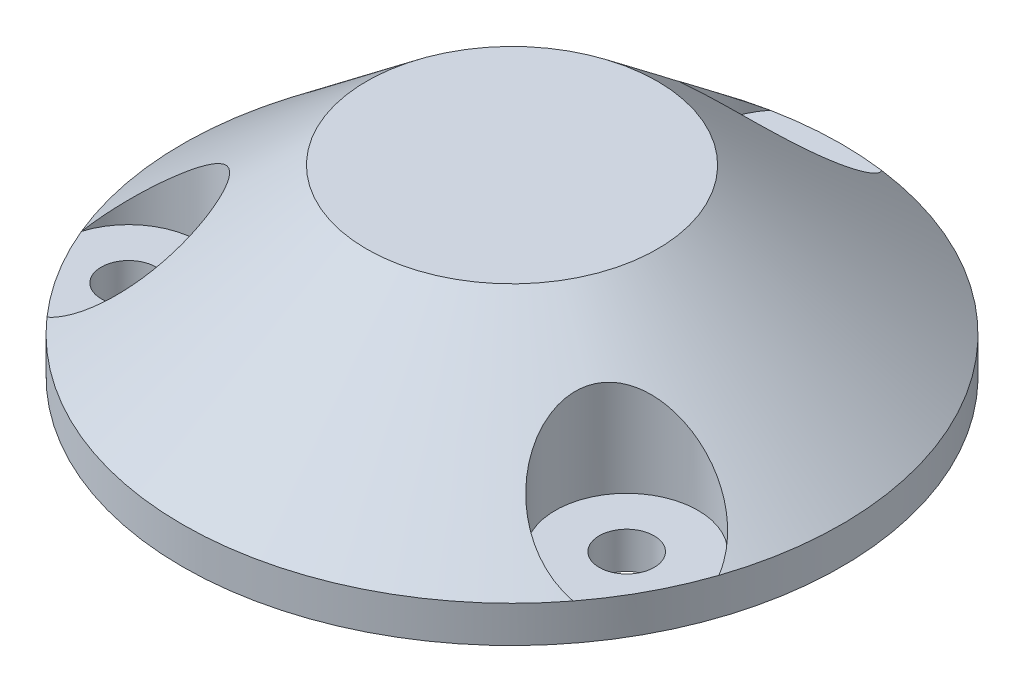
ISO-10303-21;
HEADER;
FILE_DESCRIPTION(('STEP AP214'),'2;1');
FILE_NAME('part.step','',(''),(''),'','','');
FILE_SCHEMA(('AUTOMOTIVE_DESIGN { 1 0 10303 214 1 1 1 1 }'));
ENDSEC;
DATA;
#1=APPLICATION_CONTEXT('core data for automotive mechanical design processes');
#2=APPLICATION_PROTOCOL_DEFINITION('international standard','automotive_design',2000,#1);
#3=PRODUCT_CONTEXT('',#1,'mechanical');
#4=PRODUCT('Part','Part','',(#3));
#5=PRODUCT_RELATED_PRODUCT_CATEGORY('part','',(#4));
#6=PRODUCT_DEFINITION_FORMATION('','',#4);
#7=PRODUCT_DEFINITION_CONTEXT('part definition',#1,'design');
#8=PRODUCT_DEFINITION('design','',#6,#7);
#9=PRODUCT_DEFINITION_SHAPE('','',#8);
#10=(LENGTH_UNIT() NAMED_UNIT(*) SI_UNIT(.MILLI.,.METRE.));
#11=(NAMED_UNIT(*) PLANE_ANGLE_UNIT() SI_UNIT($,.RADIAN.));
#12=(NAMED_UNIT(*) SI_UNIT($,.STERADIAN.) SOLID_ANGLE_UNIT());
#13=UNCERTAINTY_MEASURE_WITH_UNIT(LENGTH_MEASURE(1.E-05),#10,'distance_accuracy_value','');
#14=(GEOMETRIC_REPRESENTATION_CONTEXT(3) GLOBAL_UNCERTAINTY_ASSIGNED_CONTEXT((#13)) GLOBAL_UNIT_ASSIGNED_CONTEXT((#10,
#11,#12)) REPRESENTATION_CONTEXT('',''));
#15=CARTESIAN_POINT('',(0.,0.,0.));
#16=DIRECTION('',(0.,0.,1.));
#17=DIRECTION('',(1.,0.,0.));
#18=AXIS2_PLACEMENT_3D('',#15,#16,#17);
#19=CARTESIAN_POINT('',(-0.514611842093936,11.,-15.1912861421265));
#20=DIRECTION('',(0.,-1.,0.));
#21=DIRECTION('',(0.,0.,-1.));
#22=AXIS2_PLACEMENT_3D('',#19,#20,#21);
#23=CYLINDRICAL_SURFACE('',#22,1.50000000000036);
#24=CARTESIAN_POINT('',(-0.514611842093936,7.,-15.1912861421265));
#25=DIRECTION('',(0.,-1.,0.));
#26=DIRECTION('',(0.,0.,-1.));
#27=AXIS2_PLACEMENT_3D('',#24,#25,#26);
#28=CIRCLE('',#27,1.50000000000036);
#29=CARTESIAN_POINT('',(-0.514611842093936,7.,-16.6912861421269));
#30=VERTEX_POINT('',#29);
#31=EDGE_CURVE('E112',#30,#30,#28,.T.);
#32=ORIENTED_EDGE('',*,*,#31,.T.);
#33=EDGE_LOOP('',(#32));
#34=FACE_BOUND('',#33,.T.);
#35=CARTESIAN_POINT('',(-0.514611842093936,9.,-15.1912861421265));
#36=DIRECTION('',(0.,1.,0.));
#37=DIRECTION('',(0.,0.,1.));
#38=AXIS2_PLACEMENT_3D('',#35,#36,#37);
#39=CIRCLE('',#38,1.50000000000036);
#40=CARTESIAN_POINT('',(-0.514611842093936,9.,-13.6912861421262));
#41=VERTEX_POINT('',#40);
#42=EDGE_CURVE('E113',#41,#41,#39,.F.);
#43=ORIENTED_EDGE('',*,*,#42,.F.);
#44=EDGE_LOOP('',(#43));
#45=FACE_BOUND('',#44,.T.);
#46=ADVANCED_FACE('F33',(#34,#45),#23,.F.);
#47=CARTESIAN_POINT('',(13.4133456362877,11.,7.14997614272195));
#48=DIRECTION('',(0.,-1.,0.));
#49=DIRECTION('',(0.,0.,-1.));
#50=AXIS2_PLACEMENT_3D('',#47,#48,#49);
#51=CYLINDRICAL_SURFACE('',#50,1.50000000000077);
#52=CARTESIAN_POINT('',(13.4133456362877,7.,7.14997614272195));
#53=DIRECTION('',(0.,-1.,0.));
#54=DIRECTION('',(0.,0.,-1.));
#55=AXIS2_PLACEMENT_3D('',#52,#53,#54);
#56=CIRCLE('',#55,1.50000000000077);
#57=CARTESIAN_POINT('',(13.4133456362877,7.,5.64997614272117));
#58=VERTEX_POINT('',#57);
#59=EDGE_CURVE('E116',#58,#58,#56,.T.);
#60=ORIENTED_EDGE('',*,*,#59,.T.);
#61=EDGE_LOOP('',(#60));
#62=FACE_BOUND('',#61,.T.);
#63=CARTESIAN_POINT('',(13.4133456362877,9.,7.14997614272195));
#64=DIRECTION('',(0.,1.,0.));
#65=DIRECTION('',(0.,0.,1.));
#66=AXIS2_PLACEMENT_3D('',#63,#64,#65);
#67=CIRCLE('',#66,1.50000000000077);
#68=CARTESIAN_POINT('',(13.4133456362877,9.,8.64997614272272));
#69=VERTEX_POINT('',#68);
#70=EDGE_CURVE('E78',#69,#69,#67,.F.);
#71=ORIENTED_EDGE('',*,*,#70,.F.);
#72=EDGE_LOOP('',(#71));
#73=FACE_BOUND('',#72,.T.);
#74=ADVANCED_FACE('F139',(#62,#73),#51,.F.);
#75=CARTESIAN_POINT('',(-12.8987337941931,11.,8.04130999940566));
#76=DIRECTION('',(0.,-1.,0.));
#77=DIRECTION('',(0.,0.,-1.));
#78=AXIS2_PLACEMENT_3D('',#75,#76,#77);
#79=CYLINDRICAL_SURFACE('',#78,1.5);
#80=CARTESIAN_POINT('',(-12.8987337941931,7.,8.04130999940566));
#81=DIRECTION('',(0.,-1.,0.));
#82=DIRECTION('',(0.,0.,-1.));
#83=AXIS2_PLACEMENT_3D('',#80,#81,#82);
#84=CIRCLE('',#83,1.5);
#85=CARTESIAN_POINT('',(-12.8987337941931,7.,6.54130999940567));
#86=VERTEX_POINT('',#85);
#87=EDGE_CURVE('E121',#86,#86,#84,.T.);
#88=ORIENTED_EDGE('',*,*,#87,.T.);
#89=EDGE_LOOP('',(#88));
#90=FACE_BOUND('',#89,.T.);
#91=CARTESIAN_POINT('',(-12.8987337941931,9.,8.04130999940566));
#92=DIRECTION('',(0.,1.,0.));
#93=DIRECTION('',(0.,0.,1.));
#94=AXIS2_PLACEMENT_3D('',#91,#92,#93);
#95=CIRCLE('',#94,1.5);
#96=CARTESIAN_POINT('',(-12.8987337941931,9.,9.54130999940566));
#97=VERTEX_POINT('',#96);
#98=EDGE_CURVE('E79',#97,#97,#95,.F.);
#99=ORIENTED_EDGE('',*,*,#98,.F.);
#100=EDGE_LOOP('',(#99));
#101=FACE_BOUND('',#100,.T.);
#102=ADVANCED_FACE('F136',(#90,#101),#79,.F.);
#103=CARTESIAN_POINT('',(0.,9.,0.));
#104=DIRECTION('',(0.,-1.,0.));
#105=DIRECTION('',(0.,0.,-1.));
#106=AXIS2_PLACEMENT_3D('',#103,#104,#105);
#107=CYLINDRICAL_SURFACE('',#106,18.);
#108=CARTESIAN_POINT('',(0.,9.,0.));
#109=DIRECTION('',(0.,1.,0.));
#110=DIRECTION('',(0.,0.,1.));
#111=AXIS2_PLACEMENT_3D('',#108,#109,#110);
#112=CIRCLE('',#111,18.);
#113=CARTESIAN_POINT('',(14.285312354494,9.,10.9512488299071));
#114=VERTEX_POINT('',#113);
#115=CARTESIAN_POINT('',(17.0552623288384,9.,5.75482640003215));
#116=VERTEX_POINT('',#115);
#117=EDGE_CURVE('E96',#114,#116,#112,.T.);
#118=ORIENTED_EDGE('',*,*,#117,.F.);
#119=CARTESIAN_POINT('',(-13.5114570212166,9.,11.8928772449654));
#120=VERTEX_POINT('',#119);
#121=EDGE_CURVE('E93',#120,#114,#112,.T.);
#122=ORIENTED_EDGE('',*,*,#121,.F.);
#123=CARTESIAN_POINT('',(0.,9.,0.));
#124=DIRECTION('',(0.,1.,0.));
#125=DIRECTION('',(0.,0.,1.));
#126=AXIS2_PLACEMENT_3D('',#123,#124,#125);
#127=CIRCLE('',#126,18.);
#128=CARTESIAN_POINT('',(-16.626715867111,9.,6.89581898503428));
#129=VERTEX_POINT('',#128);
#130=EDGE_CURVE('E72',#129,#120,#127,.T.);
#131=ORIENTED_EDGE('',*,*,#130,.F.);
#132=CARTESIAN_POINT('',(-3.54380530761995,9.,-17.6477036449983));
#133=VERTEX_POINT('',#132);
#134=EDGE_CURVE('E95',#133,#129,#112,.T.);
#135=ORIENTED_EDGE('',*,*,#134,.F.);
#136=CARTESIAN_POINT('',(0.,9.,0.));
#137=DIRECTION('',(0.,1.,0.));
#138=DIRECTION('',(0.,0.,1.));
#139=AXIS2_PLACEMENT_3D('',#136,#137,#138);
#140=CIRCLE('',#139,18.);
#141=CARTESIAN_POINT('',(2.34140351261658,9.,-17.8470678149411));
#142=VERTEX_POINT('',#141);
#143=EDGE_CURVE('E111',#142,#133,#140,.T.);
#144=ORIENTED_EDGE('',*,*,#143,.F.);
#145=EDGE_CURVE('E102',#116,#142,#112,.T.);
#146=ORIENTED_EDGE('',*,*,#145,.F.);
#147=EDGE_LOOP('',(#118,#122,#131,#135,#144,#146));
#148=FACE_BOUND('',#147,.T.);
#149=CARTESIAN_POINT('',(0.,7.,0.));
#150=DIRECTION('',(0.,1.,0.));
#151=DIRECTION('',(0.,0.,1.));
#152=AXIS2_PLACEMENT_3D('',#149,#150,#151);
#153=CIRCLE('',#152,18.);
#154=CARTESIAN_POINT('',(0.,7.,18.));
#155=VERTEX_POINT('',#154);
#156=EDGE_CURVE('E100',#155,#155,#153,.T.);
#157=ORIENTED_EDGE('',*,*,#156,.T.);
#158=EDGE_LOOP('',(#157));
#159=FACE_BOUND('',#158,.T.);
#160=ADVANCED_FACE('F35',(#148,#159),#107,.T.);
#161=CARTESIAN_POINT('',(0.,9.,0.));
#162=DIRECTION('',(0.,-1.,0.));
#163=DIRECTION('',(0.,0.,1.));
#164=AXIS2_PLACEMENT_3D('',#161,#162,#163);
#165=CONICAL_SURFACE('',#164,18.,0.898844564777082);
#166=CARTESIAN_POINT('',(0.,17.,0.));
#167=DIRECTION('',(0.,1.,0.));
#168=DIRECTION('',(0.,0.,1.));
#169=AXIS2_PLACEMENT_3D('',#166,#167,#168);
#170=CIRCLE('',#169,7.94262160864832);
#171=CARTESIAN_POINT('',(0.,17.,7.94262160864832));
#172=VERTEX_POINT('',#171);
#173=EDGE_CURVE('E104',#172,#172,#170,.T.);
#174=ORIENTED_EDGE('',*,*,#173,.F.);
#175=EDGE_LOOP('',(#174));
#176=FACE_BOUND('',#175,.T.);
#177=ORIENTED_EDGE('',*,*,#145,.T.);
#178=CARTESIAN_POINT('',(2.34113490959982,8.99980000000001,-17.8473566400973));
#179=CARTESIAN_POINT('',(2.42701572080252,9.06374351745863,-17.755010821718));
#180=CARTESIAN_POINT('',(2.50749446459923,9.13011523699404,-17.6595092912548));
#181=CARTESIAN_POINT('',(2.65760055021501,9.2671080458631,-17.4633600133809));
#182=CARTESIAN_POINT('',(2.72723869500226,9.33772480631882,-17.3627175236883));
#183=CARTESIAN_POINT('',(2.91927642953479,9.55434657441227,-17.055791958616));
#184=CARTESIAN_POINT('',(3.02584809375703,9.70591863610809,-16.8433548860346));
#185=CARTESIAN_POINT('',(3.19705832642511,10.0189818443623,-16.4109083589611));
#186=CARTESIAN_POINT('',(3.2618558817211,10.1804327918787,-16.1909310109136));
#187=CARTESIAN_POINT('',(3.35204804274237,10.5108013920923,-15.7481117724575));
#188=CARTESIAN_POINT('',(3.37738230356679,10.6797300744798,-15.525266019408));
#189=CARTESIAN_POINT('',(3.3911927668108,11.049551806015,-15.046059251958));
#190=CARTESIAN_POINT('',(3.3730600760506,11.2512032954535,-14.7900940366322));
#191=CARTESIAN_POINT('',(3.28774100163588,11.6562154130547,-14.2872888941515));
#192=CARTESIAN_POINT('',(3.22049799602491,11.8595777459889,-14.0404598460136));
#193=CARTESIAN_POINT('',(3.07948142047743,12.1711774577643,-13.6707407490222));
#194=CARTESIAN_POINT('',(3.02247628135422,12.2807598386351,-13.5423744546591));
#195=CARTESIAN_POINT('',(2.89409195175072,12.497922463921,-13.2911170131804));
#196=CARTESIAN_POINT('',(2.82270911488805,12.6055021928598,-13.1682272646674));
#197=CARTESIAN_POINT('',(2.66556931498899,12.8172593663066,-12.9292351930953));
#198=CARTESIAN_POINT('',(2.57983341234066,12.9214415323122,-12.8131232567349));
#199=CARTESIAN_POINT('',(2.39371648621617,13.1249847585753,-12.5888156016109));
#200=CARTESIAN_POINT('',(2.29334468285974,13.2243488019564,-12.4806149629592));
#201=CARTESIAN_POINT('',(2.05163630158319,13.4394412062614,-12.248709222624));
#202=CARTESIAN_POINT('',(1.9062469793779,13.5533850333911,-12.1275021506897));
#203=CARTESIAN_POINT('',(1.59195927650858,13.7657112338961,-11.9035051017741));
#204=CARTESIAN_POINT('',(1.42310288351003,13.8641207443111,-11.8006829653126));
#205=CARTESIAN_POINT('',(1.10062932332797,14.0199058473709,-11.6379431698299));
#206=CARTESIAN_POINT('',(0.951399632504883,14.0815573306178,-11.5735513839985));
#207=CARTESIAN_POINT('',(0.718247616818345,14.1603643496235,-11.4903555175388));
#208=CARTESIAN_POINT('',(0.63896413765483,14.1843580319936,-11.464852194508));
#209=CARTESIAN_POINT('',(0.477674876265162,14.2272760792119,-11.4187019346674));
#210=CARTESIAN_POINT('',(0.395670379096087,14.2462027997927,-11.3980527416213));
#211=CARTESIAN_POINT('',(0.228688741598905,14.278665318045,-11.3618123790621));
#212=CARTESIAN_POINT('',(0.143691391590989,14.2921506865963,-11.3462687622102));
#213=CARTESIAN_POINT('',(-0.0278388415461789,14.3130961865641,-11.3208125836684));
#214=CARTESIAN_POINT('',(-0.114370950275397,14.3205592729799,-11.3108972610093));
#215=CARTESIAN_POINT('',(-0.288203067705207,14.3292383292996,-11.2968881962923));
#216=CARTESIAN_POINT('',(-0.375502879964038,14.3304558532688,-11.2927930062109));
#217=CARTESIAN_POINT('',(-0.550013522743239,14.3266205654735,-11.2904687445935));
#218=CARTESIAN_POINT('',(-0.63722436027878,14.321568293662,-11.2922391679344));
#219=CARTESIAN_POINT('',(-0.87503124196708,14.2992995815046,-11.305042627901));
#220=CARTESIAN_POINT('',(-1.02480011591927,14.2758500252575,-11.3219580425028));
#221=CARTESIAN_POINT('',(-1.31782991145315,14.2123402623088,-11.3719886253304));
#222=CARTESIAN_POINT('',(-1.4610876598964,14.1722720509551,-11.4051116015822));
#223=CARTESIAN_POINT('',(-1.78583888737076,14.0623787430366,-11.4992142757903));
#224=CARTESIAN_POINT('',(-1.96384371338188,13.9870713046916,-11.5658297050155));
#225=CARTESIAN_POINT('',(-2.30139570855679,13.818324197024,-11.719686652589));
#226=CARTESIAN_POINT('',(-2.46090266161879,13.7248461608638,-11.8069719014685));
#227=CARTESIAN_POINT('',(-2.81674372309663,13.4879842340551,-12.0337888827098));
#228=CARTESIAN_POINT('',(-3.00463687091629,13.3389874549689,-12.180666921339));
#229=CARTESIAN_POINT('',(-3.34504055220426,13.0269343899957,-12.4981546502066));
#230=CARTESIAN_POINT('',(-3.4975143672076,12.8638637520387,-12.6687886773707));
#231=CARTESIAN_POINT('',(-3.7715339848206,12.525364002004,-13.0335461517528));
#232=CARTESIAN_POINT('',(-3.89212568783967,12.3497193810388,-13.2281822879443));
#233=CARTESIAN_POINT('',(-4.09678108297229,11.9949449291381,-13.632627463404));
#234=CARTESIAN_POINT('',(-4.18085190138475,11.8158157852691,-13.8424335332436));
#235=CARTESIAN_POINT('',(-4.32543810813837,11.4200662330126,-14.3184954625027));
#236=CARTESIAN_POINT('',(-4.377362904007,11.2034316406195,-14.5873873379206));
#237=CARTESIAN_POINT('',(-4.42387982026804,10.7751877160253,-15.1350941697241));
#238=CARTESIAN_POINT('',(-4.41837898497454,10.5635870873534,-15.4139244864511));
#239=CARTESIAN_POINT('',(-4.36407362517126,10.2542159909785,-15.8328899280651));
#240=CARTESIAN_POINT('',(-4.33815030453592,10.1521402110075,-15.9730815048742));
#241=CARTESIAN_POINT('',(-4.27026823805033,9.95153023167647,-16.2522618692488));
#242=CARTESIAN_POINT('',(-4.22830504823459,9.85299702209667,-16.391250312554));
#243=CARTESIAN_POINT('',(-4.12807335889373,9.66081235390146,-16.6657946170354));
#244=CARTESIAN_POINT('',(-4.06987160961678,9.56714273414394,-16.8013621039368));
#245=CARTESIAN_POINT('',(-3.9367444743538,9.38528899443614,-17.0677550846856));
#246=CARTESIAN_POINT('',(-3.86183707820661,9.29709910317433,-17.1985855048935));
#247=CARTESIAN_POINT('',(-3.74248854945813,9.17550676469612,-17.3810684394058));
#248=CARTESIAN_POINT('',(-3.70490079779351,9.13942999143173,-17.4354960361121));
#249=CARTESIAN_POINT('',(-3.62658721131277,9.06860407701022,-17.542885685541));
#250=CARTESIAN_POINT('',(-3.58586291675542,9.03385429659149,-17.5958484404532));
#251=CARTESIAN_POINT('',(-3.54355686610747,8.9998,-17.6480099852769));
#252=B_SPLINE_CURVE_WITH_KNOTS('',3,(#178,#179,#180,#181,#182,#183,#184,#185,#186,#187,#188,
#189,#190,#191,#192,#193,#194,#195,#196,#197,#198,#199,#200,#201,#202,#203,#204,#205,#206,#207,
#208,#209,#210,#211,#212,#213,#214,#215,#216,#217,#218,#219,#220,#221,#222,#223,#224,#225,#226,
#227,#228,#229,#230,#231,#232,#233,#234,#235,#236,#237,#238,#239,#240,#241,#242,#243,#244,#245,
#246,#247,#248,#249,#250,#251),.UNSPECIFIED.,.F.,.F.,(4,2,2,2,2,2,2,2,2,2,2,2,2,2,2,2,2,2,2,2,2,
2,2,2,2,2,2,2,2,2,2,2,2,2,2,2,4),(0.,0.42381303291384,0.847200982373288,1.68879328672344,
2.52716339000765,3.36681422442537,4.34198556248684,5.31828300717932,5.85215540922252,
6.38616337954061,6.91939455447413,7.45229125164004,8.11288904899692,8.77231975671547,
9.29161105250593,9.55134889017835,9.81096575996782,10.0729362882976,10.3347781952427,
10.5965549456589,10.8583091535004,11.3136640702543,11.7692385714709,12.3791540852491,
12.9903716930633,13.829465170552,14.6694246745238,15.5322321783,16.3948712472437,
17.4377314797615,18.4822800663795,19.0076769861292,19.5332195766516,20.0566329163804,
20.5794853056363,20.8054408733618,21.0312861802583),.UNSPECIFIED.);
#253=EDGE_CURVE('E11',#142,#133,#252,.T.);
#254=ORIENTED_EDGE('',*,*,#253,.T.);
#255=ORIENTED_EDGE('',*,*,#134,.T.);
#256=CARTESIAN_POINT('',(-16.6268316955249,8.99980000000029,6.89619601464787));
#257=CARTESIAN_POINT('',(-16.5897982764765,9.06374351745895,6.77564814125906));
#258=CARTESIAN_POINT('',(-16.5473308968935,9.1301152369944,6.65820073943485));
#259=CARTESIAN_POINT('',(-16.4525136821285,9.26710804586352,6.43013041709193));
#260=CARTESIAN_POINT('',(-16.4001738017482,9.33772480631927,6.31950076978744));
#261=CARTESIAN_POINT('',(-16.2303873325908,9.55434657441283,5.99972843066085));
#262=CARTESIAN_POINT('',(-16.0996972631408,9.70591863610871,5.80121612583009));
#263=CARTESIAN_POINT('',(-15.8107927012506,10.018981844363,5.4367204514149));
#264=CARTESIAN_POINT('',(-15.6526855072323,10.1804327918796,5.2706154484017));
#265=CARTESIAN_POINT('',(-15.3142888779552,10.5108013920932,4.97109712650698));
#266=CARTESIAN_POINT('',(-15.133965925101,10.6797300744809,4.83773413652218));
#267=CARTESIAN_POINT('',(-14.7258659224457,11.0495518060162,4.58617054078991));
#268=CARTESIAN_POINT('',(-14.4951271981082,11.2512032954547,4.4738913039643));
#269=CARTESIAN_POINT('',(-14.0170256343589,11.6562154130561,4.29637721859456));
#270=CARTESIAN_POINT('',(-13.769643905474,11.8595777459903,4.23119684561162));
#271=CARTESIAN_POINT('',(-13.3789494874413,12.1711774577658,4.16846123389482));
#272=CARTESIAN_POINT('',(-13.2392784459715,12.2807598386366,4.15364598534025));
#273=CARTESIAN_POINT('',(-12.9574909539592,12.4979224639226,4.13920135548545));
#274=CARTESIAN_POINT('',(-12.8153738914509,12.6055021928614,4.1395758313463));
#275=CARTESIAN_POINT('',(-12.5298307862168,12.8172593663082,4.15616685421851));
#276=CARTESIAN_POINT('',(-12.3864069483219,12.9214415323139,4.1723603557482));
#277=CARTESIAN_POINT('',(-12.0990923576589,13.1249847585769,4.22138851428441));
#278=CARTESIAN_POINT('',(-11.9552019542026,13.2243488019581,4.25421272648894));
#279=CARTESIAN_POINT('',(-11.6335115011506,13.439441206263,4.34758545481458));
#280=CARTESIAN_POINT('',(-11.4558484366346,13.5533850333927,4.41289276531627));
#281=CARTESIAN_POINT('',(-11.1047174504662,13.7657112338976,4.57307537564042));
#282=CARTESIAN_POINT('',(-10.93124267172,13.8641207443125,4.66789823333787));
#283=CARTESIAN_POINT('',(-10.6290690945343,14.0199058473723,4.86579863076309));
#284=CARTESIAN_POINT('',(-10.4986893267978,14.0815573306192,4.96283944109912));
#285=CARTESIAN_POINT('',(-10.3100635851105,14.1603643496247,5.1231570763974));
#286=CARTESIAN_POINT('',(-10.2483353199032,14.1843580319948,5.17906692193805));
#287=CARTESIAN_POINT('',(-10.1277233917952,14.2272760792131,5.29567238973887));
#288=CARTESIAN_POINT('',(-10.0688384174651,14.2462027997938,5.35636577098881));
#289=CARTESIAN_POINT('',(-9.95396252409786,14.2786653180461,5.4828559297473));
#290=CARTESIAN_POINT('',(-9.89800268203351,14.2921506865974,5.54869398568259));
#291=CARTESIAN_POINT('',(-9.79019186816444,14.3130961865651,5.68451543582554));
#292=CARTESIAN_POINT('',(-9.73833889249037,14.320559272981,5.75449677889856));
#293=CARTESIAN_POINT('',(-9.63929062784732,14.3292383293006,5.89803527622794));
#294=CARTESIAN_POINT('',(-9.59209418307413,14.3304558532698,5.97159153634902));
#295=CARTESIAN_POINT('',(-9.50282599207881,14.3266205654744,6.12156005541784));
#296=CARTESIAN_POINT('',(-9.46075380489971,14.3215682936629,6.19797206787939));
#297=CARTESIAN_POINT('',(-9.35293848564304,14.2992995815055,6.41032059859957));
#298=CARTESIAN_POINT('',(-9.29270322742763,14.2758500252583,6.54848195543926));
#299=CARTESIAN_POINT('',(-9.18951608535556,14.2123402623096,6.82726849385119));
#300=CARTESIAN_POINT('',(-9.14657255001698,14.1722720509559,6.96789483141793));
#301=CARTESIAN_POINT('',(-9.06569224270813,14.0623787430373,7.29618898142507));
#302=CARTESIAN_POINT('',(-9.0343804836956,13.9870713046922,7.48365339735959));
#303=CARTESIAN_POINT('',(-8.99884851125553,13.8183241970245,7.85291047406606));
#304=CARTESIAN_POINT('',(-8.99468627762989,13.7248461608642,8.03469017193784));
#305=CARTESIAN_POINT('',(-9.01319501465565,13.4879842340553,8.45626606150804));
#306=CARTESIAN_POINT('',(-9.04644855345679,13.338987454969,8.69242532003157));
#307=CARTESIAN_POINT('',(-9.1511991514021,13.0269343899957,9.14596742000266));
#308=CARTESIAN_POINT('',(-9.22273564617472,12.8638637520386,9.36333063078964));
#309=CARTESIAN_POINT('',(-9.40161507640347,12.5253640020037,9.78301731796893));
#310=CARTESIAN_POINT('',(-9.50987906333031,12.3497193810384,9.98477086436487));
#311=CARTESIAN_POINT('',(-9.75781116215039,11.9949449291375,10.3642302233012));
#312=CARTESIAN_POINT('',(-9.89747313929355,11.8158157852684,10.5419407226832));
#313=CARTESIAN_POINT('',(-10.23746176043,11.4200662330117,10.9051870153983));
#314=CARTESIAN_POINT('',(-10.4443665574789,11.2034316406187,11.0846011454157));
#315=CARTESIAN_POINT('',(-10.8954361295168,10.7751877160243,11.3987393925052));
#316=CARTESIAN_POINT('',(-11.1396606847945,10.5635870873524,11.5333906877625));
#317=CARTESIAN_POINT('',(-11.5296480804418,10.2542159909774,11.6958435874182));
#318=CARTESIAN_POINT('',(-11.6640192076727,10.1521402110064,11.743489121602));
#319=CARTESIAN_POINT('',(-11.9397375287019,9.95153023167539,11.8242917097513));
#320=CARTESIAN_POINT('',(-12.0810866463445,9.85299702209559,11.8574447429996));
#321=CARTESIAN_POINT('',(-12.3689648331602,9.66081235390039,11.9079137060068));
#322=CARTESIAN_POINT('',(-12.5154705953826,9.56714273414287,11.925293256039));
#323=CARTESIAN_POINT('',(-12.8127372517325,9.38528899443508,11.9431982653425));
#324=CARTESIAN_POINT('',(-12.9634934172939,9.29709910317329,11.9437417674515));
#325=CARTESIAN_POINT('',(-13.1812025387127,9.17550676469528,11.9316243769072));
#326=CARTESIAN_POINT('',(-13.2471320959593,9.13942999143106,11.9262862274476));
#327=CARTESIAN_POINT('',(-13.379291053708,9.06860407700989,11.9121594968083));
#328=CARTESIAN_POINT('',(-13.4455202921947,9.03385429659133,11.9033726006266));
#329=CARTESIAN_POINT('',(-13.5118465404364,8.9998,11.8928152584436));
#330=B_SPLINE_CURVE_WITH_KNOTS('',3,(#256,#257,#258,#259,#260,#261,#262,#263,#264,#265,#266,
#267,#268,#269,#270,#271,#272,#273,#274,#275,#276,#277,#278,#279,#280,#281,#282,#283,#284,#285,
#286,#287,#288,#289,#290,#291,#292,#293,#294,#295,#296,#297,#298,#299,#300,#301,#302,#303,#304,
#305,#306,#307,#308,#309,#310,#311,#312,#313,#314,#315,#316,#317,#318,#319,#320,#321,#322,#323,
#324,#325,#326,#327,#328,#329),.UNSPECIFIED.,.F.,.F.,(4,2,2,2,2,2,2,2,2,2,2,2,2,2,2,2,2,2,2,2,2,
2,2,2,2,2,2,2,2,2,2,2,2,2,2,2,4),(0.,0.423813032913981,0.847200982373569,1.68879328672401,
2.5271633900085,3.3668142244265,4.34198556248828,5.31828300718107,5.85215540922441,
6.38616337954262,6.91939455447627,7.4522912516423,8.11288904899909,8.77231975671753,
9.29161105250798,9.55134889018039,9.81096575996986,10.0729362882996,10.3347781952448,
10.5965549456609,10.8583091535024,11.3136640702564,11.769238571473,12.3791540852515,
12.9903716930659,13.829465170555,14.6694246745272,15.5322321783038,16.3948712472478,
17.437731479766,18.4822800663843,19.0076769861341,19.5332195766566,20.0566329163855,
20.5794853056414,20.8054408733658,21.0312861802612),.UNSPECIFIED.);
#331=EDGE_CURVE('E84',#129,#120,#330,.T.);
#332=ORIENTED_EDGE('',*,*,#331,.T.);
#333=ORIENTED_EDGE('',*,*,#121,.T.);
#334=CARTESIAN_POINT('',(14.2856967859249,8.9998,10.9511606254491));
#335=CARTESIAN_POINT('',(14.1627825556738,9.06374351745866,10.9793626804586));
#336=CARTESIAN_POINT('',(14.039836432294,9.13011523699411,11.0013085518196));
#337=CARTESIAN_POINT('',(13.7949131319132,9.26710804586324,11.0332295962885));
#338=CARTESIAN_POINT('',(13.6729351067457,9.337724806319,11.0432167539003));
#339=CARTESIAN_POINT('',(13.3111109030558,9.55434657441256,11.0560635279544));
#340=CARTESIAN_POINT('',(13.0738491693836,9.70591863610844,11.0421387602037));
#341=CARTESIAN_POINT('',(12.6137343748254,10.0189818443628,10.9741879075452));
#342=CARTESIAN_POINT('',(12.3908296255111,10.1804327918793,10.9203155625108));
#343=CARTESIAN_POINT('',(11.9622408352129,10.5108013920929,10.7770146459492));
#344=CARTESIAN_POINT('',(11.7565836215344,10.6797300744806,10.6875318828844));
#345=CARTESIAN_POINT('',(11.3346731556353,11.0495518060159,10.4598887111666));
#346=CARTESIAN_POINT('',(11.122067122058,11.2512032954544,10.3162027326662));
#347=CARTESIAN_POINT('',(10.7292846327236,11.6562154130558,9.99091167555509));
#348=CARTESIAN_POINT('',(10.5491459094498,11.85957774599,9.80926300040012));
#349=CARTESIAN_POINT('',(10.2994680669648,12.1711774577655,9.50227951512543));
#350=CARTESIAN_POINT('',(10.2168021646183,12.2807598386363,9.38872846931683));
#351=CARTESIAN_POINT('',(10.0633990022097,12.4979224639223,9.15191565769289));
#352=CARTESIAN_POINT('',(9.99266477656415,12.605502192861,9.02865143331908));
#353=CARTESIAN_POINT('',(9.86426147122921,12.8172593663078,8.77306833887471));
#354=CARTESIAN_POINT('',(9.8065735359827,12.9214415323135,8.6407629009846));
#355=CARTESIAN_POINT('',(9.70537587144437,13.1249847585765,8.36742708732442));
#356=CARTESIAN_POINT('',(9.66185727134455,13.2243488019576,8.22640223646818));
#357=CARTESIAN_POINT('',(9.58187519956927,13.4394412062626,7.90112376780744));
#358=CARTESIAN_POINT('',(9.54960145725859,13.5533850333922,7.71460938537155));
#359=CARTESIAN_POINT('',(9.51275817395969,13.765711233897,7.33042972613189));
#360=CARTESIAN_POINT('',(9.50813978821202,13.8641207443119,7.13278473197305));
#361=CARTESIAN_POINT('',(9.52843977120849,14.0199058473716,6.77214453906529));
#362=CARTESIAN_POINT('',(9.54728969429505,14.0815573306185,6.61071194289791));
#363=CARTESIAN_POINT('',(9.59181596829442,14.1603643496241,6.36719844113999));
#364=CARTESIAN_POINT('',(9.60937118225064,14.1843580319941,6.28578527256859));
#365=CARTESIAN_POINT('',(9.65004851553232,14.2272760792124,6.12302954492724));
#366=CARTESIAN_POINT('',(9.67316803837128,14.2462027997931,6.0416869706312));
#367=CARTESIAN_POINT('',(9.72527378250125,14.2786653180454,5.87895644931353));
#368=CARTESIAN_POINT('',(9.75431129044482,14.2921506865966,5.7975747765264));
#369=CARTESIAN_POINT('',(9.81803070971293,14.3130961865643,5.63629714784166));
#370=CARTESIAN_POINT('',(9.85270984276808,14.3205592729802,5.5564004821096));
#371=CARTESIAN_POINT('',(9.92749369555485,14.3292383292998,5.39885292006329));
#372=CARTESIAN_POINT('',(9.96759706304048,14.330455853269,5.32120146986087));
#373=CARTESIAN_POINT('',(10.0528395148244,14.3266205654736,5.16890868917465));
#374=CARTESIAN_POINT('',(10.0979781651808,14.3215682936621,5.09426710005402));
#375=CARTESIAN_POINT('',(10.2279697276124,14.2992995815046,4.89472202930055));
#376=CARTESIAN_POINT('',(10.3175033433492,14.2758500252575,4.77347608706266));
#377=CARTESIAN_POINT('',(10.5073459968111,14.2123402623087,4.5447201314784));
#378=CARTESIAN_POINT('',(10.6076602099157,14.172272050955,4.43721677016352));
#379=CARTESIAN_POINT('',(10.8515311300813,14.0623787430364,4.20302529436461));
#380=CARTESIAN_POINT('',(10.99822419708,13.9870713046913,4.08217630765534));
#381=CARTESIAN_POINT('',(11.3002442198149,13.8183241970236,3.86677617852247));
#382=CARTESIAN_POINT('',(11.4555889392513,13.7248461608633,3.7722817295303));
#383=CARTESIAN_POINT('',(11.829938737755,13.4879842340544,3.5775228212015));
#384=CARTESIAN_POINT('',(12.0510854243759,13.3389874549681,3.48824160130728));
#385=CARTESIAN_POINT('',(12.4962397036092,13.0269343899948,3.35218723020403));
#386=CARTESIAN_POINT('',(12.7202500133852,12.8638637520377,3.30545804658134));
#387=CARTESIAN_POINT('',(13.173149061227,12.5253640020028,3.25052883378432));
#388=CARTESIAN_POINT('',(13.4020047511729,12.3497193810375,3.24341142358));
#389=CARTESIAN_POINT('',(13.8545922451256,11.9949449291365,3.26839724010365));
#390=CARTESIAN_POINT('',(14.0783250406812,11.8158157852675,3.30049281056142));
#391=CARTESIAN_POINT('',(14.5628998685711,11.4200662330108,3.41330844710572));
#392=CARTESIAN_POINT('',(14.8217294614885,11.2034316406178,3.50278619250624));
#393=CARTESIAN_POINT('',(15.3193159497873,10.7751877160235,3.7363547772205));
#394=CARTESIAN_POINT('',(15.5580396697714,10.5635870873516,3.88053379869035));
#395=CARTESIAN_POINT('',(15.8937217056152,10.2542159909766,4.13704634064889));
#396=CARTESIAN_POINT('',(16.0021695122107,10.1521402110056,4.22959238327413));
#397=CARTESIAN_POINT('',(16.2100057667541,9.9515302316746,4.42797015949948));
#398=CARTESIAN_POINT('',(16.309391694581,9.8529970220948,4.53380556955639));
#399=CARTESIAN_POINT('',(16.4970381920556,9.66081235389962,4.7578809110306));
#400=CARTESIAN_POINT('',(16.585342205001,9.56714273414212,4.87606884789994));
#401=CARTESIAN_POINT('',(16.7494817260877,9.38528899443436,5.12455681934523));
#402=CARTESIAN_POINT('',(16.8253304955019,9.29709910317257,5.25484373744403));
#403=CARTESIAN_POINT('',(16.9236910881722,9.1755067646947,5.44944406250029));
#404=CARTESIAN_POINT('',(16.9520328937542,9.13942999143061,5.50920980866565));
#405=CARTESIAN_POINT('',(17.0058782650223,9.06860407700968,5.63072618873292));
#406=CARTESIAN_POINT('',(17.0313832089518,9.03385429659122,5.69247583982639));
#407=CARTESIAN_POINT('',(17.0554034065457,8.9998,5.75519472683263));
#408=B_SPLINE_CURVE_WITH_KNOTS('',3,(#334,#335,#336,#337,#338,#339,#340,#341,#342,#343,#344,
#345,#346,#347,#348,#349,#350,#351,#352,#353,#354,#355,#356,#357,#358,#359,#360,#361,#362,#363,
#364,#365,#366,#367,#368,#369,#370,#371,#372,#373,#374,#375,#376,#377,#378,#379,#380,#381,#382,
#383,#384,#385,#386,#387,#388,#389,#390,#391,#392,#393,#394,#395,#396,#397,#398,#399,#400,#401,
#402,#403,#404,#405,#406,#407),.UNSPECIFIED.,.F.,.F.,(4,2,2,2,2,2,2,2,2,2,2,2,2,2,2,2,2,2,2,2,2,
2,2,2,2,2,2,2,2,2,2,2,2,2,2,2,4),(0.,0.423813032913972,0.847200982373548,1.68879328672396,
2.52716339000843,3.36681422442641,4.34198556248816,5.31828300718093,5.85215540922423,
6.38616337954241,6.91939455447602,7.45229125164203,8.11288904899869,8.772319756717,
9.2916110525074,9.55134889017977,9.81096575996921,10.0729362882989,10.334778195244,
10.5965549456601,10.8583091535016,11.3136640702556,11.7692385714722,12.3791540852506,
12.9903716930651,13.8294651705542,14.6694246745263,15.5322321783029,16.3948712472469,
17.4377314797651,18.4822800663834,19.007676986133,19.5332195766555,20.0566329163843,
20.5794853056403,20.8054408733639,21.0312861802586),.UNSPECIFIED.);
#409=EDGE_CURVE('E47',#114,#116,#408,.T.);
#410=ORIENTED_EDGE('',*,*,#409,.T.);
#411=EDGE_LOOP('',(#177,#254,#255,#332,#333,#410));
#412=FACE_BOUND('',#411,.T.);
#413=ADVANCED_FACE('F91',(#176,#412),#165,.T.);
#414=CARTESIAN_POINT('',(0.,17.,0.));
#415=DIRECTION('',(0.,1.,0.));
#416=DIRECTION('',(0.,0.,1.));
#417=AXIS2_PLACEMENT_3D('',#414,#415,#416);
#418=PLANE('',#417);
#419=ORIENTED_EDGE('',*,*,#173,.T.);
#420=EDGE_LOOP('',(#419));
#421=FACE_BOUND('',#420,.T.);
#422=ADVANCED_FACE('F128',(#421),#418,.T.);
#423=CARTESIAN_POINT('',(-12.8987337941925,9.,8.04130999940528));
#424=DIRECTION('',(0.,1.,0.));
#425=DIRECTION('',(0.,0.,1.));
#426=AXIS2_PLACEMENT_3D('',#423,#424,#425);
#427=CYLINDRICAL_SURFACE('',#426,3.90000000000087);
#428=CARTESIAN_POINT('',(-12.8987337941925,9.,8.04130999940528));
#429=DIRECTION('',(0.,1.,0.));
#430=DIRECTION('',(0.,0.,1.));
#431=AXIS2_PLACEMENT_3D('',#428,#429,#430);
#432=CIRCLE('',#431,3.90000000000087);
#433=EDGE_CURVE('E53',#120,#129,#432,.T.);
#434=ORIENTED_EDGE('',*,*,#433,.F.);
#435=ORIENTED_EDGE('',*,*,#331,.F.);
#436=EDGE_LOOP('',(#434,#435));
#437=FACE_BOUND('',#436,.T.);
#438=ADVANCED_FACE('F83',(#437),#427,.F.);
#439=CARTESIAN_POINT('',(-12.8987337941925,9.,8.04130999940528));
#440=DIRECTION('',(0.,1.,0.));
#441=DIRECTION('',(0.,0.,1.));
#442=AXIS2_PLACEMENT_3D('',#439,#440,#441);
#443=PLANE('',#442);
#444=ORIENTED_EDGE('',*,*,#98,.T.);
#445=EDGE_LOOP('',(#444));
#446=FACE_BOUND('',#445,.T.);
#447=ORIENTED_EDGE('',*,*,#130,.T.);
#448=ORIENTED_EDGE('',*,*,#433,.T.);
#449=EDGE_LOOP('',(#447,#448));
#450=FACE_BOUND('',#449,.T.);
#451=ADVANCED_FACE('F73',(#446,#450),#443,.T.);
#452=CARTESIAN_POINT('',(13.4133456362877,9.,7.14997614272122));
#453=DIRECTION('',(0.,1.,0.));
#454=DIRECTION('',(0.,0.,1.));
#455=AXIS2_PLACEMENT_3D('',#452,#453,#454);
#456=CYLINDRICAL_SURFACE('',#455,3.9000000000006);
#457=CARTESIAN_POINT('',(13.4133456362877,9.,7.14997614272122));
#458=DIRECTION('',(0.,1.,0.));
#459=DIRECTION('',(0.,0.,1.));
#460=AXIS2_PLACEMENT_3D('',#457,#458,#459);
#461=CIRCLE('',#460,3.9000000000006);
#462=EDGE_CURVE('E85',#116,#114,#461,.T.);
#463=ORIENTED_EDGE('',*,*,#462,.F.);
#464=ORIENTED_EDGE('',*,*,#409,.F.);
#465=EDGE_LOOP('',(#463,#464));
#466=FACE_BOUND('',#465,.T.);
#467=ADVANCED_FACE('F165',(#466),#456,.F.);
#468=CARTESIAN_POINT('',(13.4133456362877,9.,7.14997614272122));
#469=DIRECTION('',(0.,1.,0.));
#470=DIRECTION('',(0.,0.,1.));
#471=AXIS2_PLACEMENT_3D('',#468,#469,#470);
#472=PLANE('',#471);
#473=ORIENTED_EDGE('',*,*,#70,.T.);
#474=EDGE_LOOP('',(#473));
#475=FACE_BOUND('',#474,.T.);
#476=ORIENTED_EDGE('',*,*,#117,.T.);
#477=ORIENTED_EDGE('',*,*,#462,.T.);
#478=EDGE_LOOP('',(#476,#477));
#479=FACE_BOUND('',#478,.T.);
#480=ADVANCED_FACE('F169',(#475,#479),#472,.T.);
#481=CARTESIAN_POINT('',(-0.514611842093936,9.,-15.1912861421265));
#482=DIRECTION('',(0.,1.,0.));
#483=DIRECTION('',(0.,0.,1.));
#484=AXIS2_PLACEMENT_3D('',#481,#482,#483);
#485=CYLINDRICAL_SURFACE('',#484,3.9);
#486=CARTESIAN_POINT('',(-0.514611842093936,9.,-15.1912861421265));
#487=DIRECTION('',(0.,1.,0.));
#488=DIRECTION('',(0.,0.,1.));
#489=AXIS2_PLACEMENT_3D('',#486,#487,#488);
#490=CIRCLE('',#489,3.9);
#491=EDGE_CURVE('E60',#133,#142,#490,.T.);
#492=ORIENTED_EDGE('',*,*,#491,.F.);
#493=ORIENTED_EDGE('',*,*,#253,.F.);
#494=EDGE_LOOP('',(#492,#493));
#495=FACE_BOUND('',#494,.T.);
#496=ADVANCED_FACE('F172',(#495),#485,.F.);
#497=CARTESIAN_POINT('',(-0.514611842093936,9.,-15.1912861421265));
#498=DIRECTION('',(0.,1.,0.));
#499=DIRECTION('',(0.,0.,1.));
#500=AXIS2_PLACEMENT_3D('',#497,#498,#499);
#501=PLANE('',#500);
#502=ORIENTED_EDGE('',*,*,#42,.T.);
#503=EDGE_LOOP('',(#502));
#504=FACE_BOUND('',#503,.T.);
#505=ORIENTED_EDGE('',*,*,#143,.T.);
#506=ORIENTED_EDGE('',*,*,#491,.T.);
#507=EDGE_LOOP('',(#505,#506));
#508=FACE_BOUND('',#507,.T.);
#509=ADVANCED_FACE('F177',(#504,#508),#501,.T.);
#510=CARTESIAN_POINT('',(0.,7.,0.));
#511=DIRECTION('',(0.,1.,0.));
#512=DIRECTION('',(0.,0.,1.));
#513=AXIS2_PLACEMENT_3D('',#510,#511,#512);
#514=PLANE('',#513);
#515=CARTESIAN_POINT('',(0.,7.,0.));
#516=DIRECTION('',(0.,-1.,0.));
#517=DIRECTION('',(0.,0.,-1.));
#518=AXIS2_PLACEMENT_3D('',#515,#516,#517);
#519=CIRCLE('',#518,9.);
#520=CARTESIAN_POINT('',(0.,7.,-9.));
#521=VERTEX_POINT('',#520);
#522=EDGE_CURVE('E194',#521,#521,#519,.T.);
#523=ORIENTED_EDGE('',*,*,#522,.F.);
#524=EDGE_LOOP('',(#523));
#525=FACE_BOUND('',#524,.T.);
#526=ORIENTED_EDGE('',*,*,#87,.F.);
#527=EDGE_LOOP('',(#526));
#528=FACE_BOUND('',#527,.T.);
#529=ORIENTED_EDGE('',*,*,#59,.F.);
#530=EDGE_LOOP('',(#529));
#531=FACE_BOUND('',#530,.T.);
#532=ORIENTED_EDGE('',*,*,#31,.F.);
#533=EDGE_LOOP('',(#532));
#534=FACE_BOUND('',#533,.T.);
#535=ORIENTED_EDGE('',*,*,#156,.F.);
#536=EDGE_LOOP('',(#535));
#537=FACE_BOUND('',#536,.T.);
#538=ADVANCED_FACE('F181',(#525,#528,#531,#534,#537),#514,.F.);
#539=CARTESIAN_POINT('',(0.,15.,0.));
#540=DIRECTION('',(0.,-1.,0.));
#541=DIRECTION('',(0.,0.,-1.));
#542=AXIS2_PLACEMENT_3D('',#539,#540,#541);
#543=CYLINDRICAL_SURFACE('',#542,9.);
#544=CARTESIAN_POINT('',(0.,15.,0.));
#545=DIRECTION('',(0.,-1.,0.));
#546=DIRECTION('',(0.,0.,-1.));
#547=AXIS2_PLACEMENT_3D('',#544,#545,#546);
#548=CIRCLE('',#547,9.);
#549=CARTESIAN_POINT('',(0.,15.,-9.));
#550=VERTEX_POINT('',#549);
#551=EDGE_CURVE('E86',#550,#550,#548,.T.);
#552=ORIENTED_EDGE('',*,*,#551,.F.);
#553=EDGE_LOOP('',(#552));
#554=FACE_BOUND('',#553,.T.);
#555=ORIENTED_EDGE('',*,*,#522,.T.);
#556=EDGE_LOOP('',(#555));
#557=FACE_BOUND('',#556,.T.);
#558=ADVANCED_FACE('F183',(#554,#557),#543,.F.);
#559=CARTESIAN_POINT('',(0.,15.,0.));
#560=DIRECTION('',(0.,-1.,0.));
#561=DIRECTION('',(0.,0.,-1.));
#562=AXIS2_PLACEMENT_3D('',#559,#560,#561);
#563=PLANE('',#562);
#564=ORIENTED_EDGE('',*,*,#551,.T.);
#565=EDGE_LOOP('',(#564));
#566=FACE_BOUND('',#565,.T.);
#567=ADVANCED_FACE('F186',(#566),#563,.T.);
#568=CLOSED_SHELL('',(#46,#74,#102,#160,#413,#422,#438,#451,#467,#480,#496,#509,#538,#558,#567));
#569=MANIFOLD_SOLID_BREP('B2',#568);
#570=ADVANCED_BREP_SHAPE_REPRESENTATION('',(#18,#569),#14);
#571=SHAPE_DEFINITION_REPRESENTATION(#9,#570);
ENDSEC;
END-ISO-10303-21;
